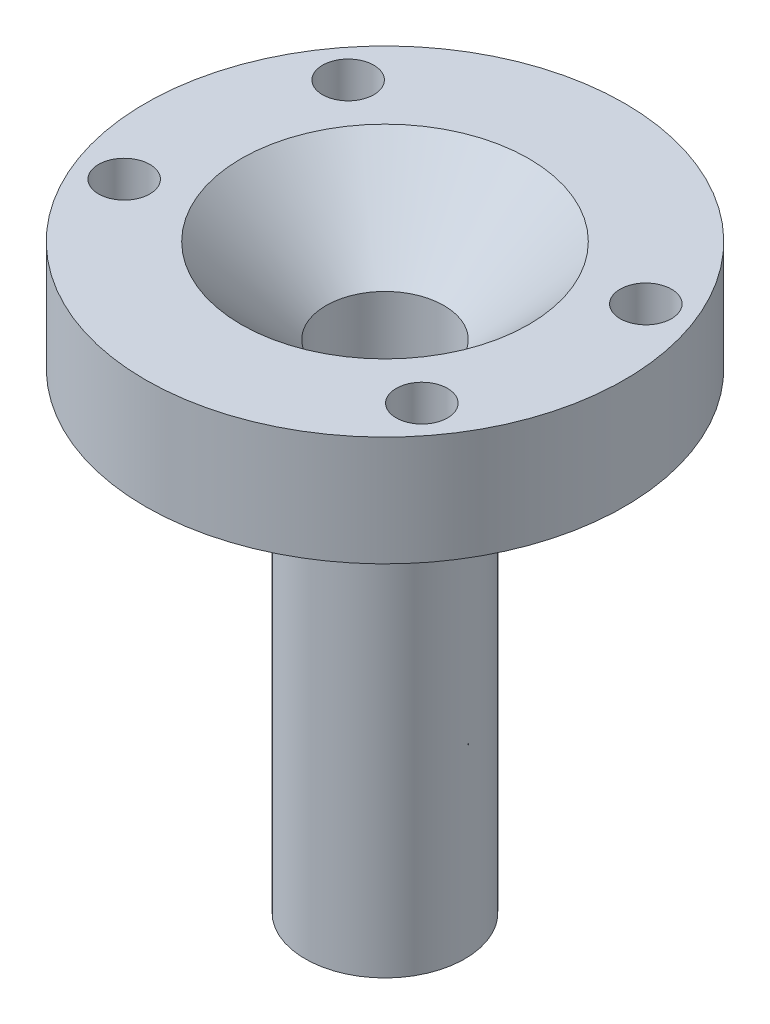
ISO-10303-21;
HEADER;
FILE_DESCRIPTION(('STEP AP214'),'2;1');
FILE_NAME('part.step','',(''),(''),'','','');
FILE_SCHEMA(('AUTOMOTIVE_DESIGN { 1 0 10303 214 1 1 1 1 }'));
ENDSEC;
DATA;
#1=APPLICATION_CONTEXT('core data for automotive mechanical design processes');
#2=APPLICATION_PROTOCOL_DEFINITION('international standard','automotive_design',2000,#1);
#3=PRODUCT_CONTEXT('',#1,'mechanical');
#4=PRODUCT('Part','Part','',(#3));
#5=PRODUCT_RELATED_PRODUCT_CATEGORY('part','',(#4));
#6=PRODUCT_DEFINITION_FORMATION('','',#4);
#7=PRODUCT_DEFINITION_CONTEXT('part definition',#1,'design');
#8=PRODUCT_DEFINITION('design','',#6,#7);
#9=PRODUCT_DEFINITION_SHAPE('','',#8);
#10=(LENGTH_UNIT() NAMED_UNIT(*) SI_UNIT(.MILLI.,.METRE.));
#11=(NAMED_UNIT(*) PLANE_ANGLE_UNIT() SI_UNIT($,.RADIAN.));
#12=(NAMED_UNIT(*) SI_UNIT($,.STERADIAN.) SOLID_ANGLE_UNIT());
#13=UNCERTAINTY_MEASURE_WITH_UNIT(LENGTH_MEASURE(1.E-05),#10,'distance_accuracy_value','');
#14=(GEOMETRIC_REPRESENTATION_CONTEXT(3) GLOBAL_UNCERTAINTY_ASSIGNED_CONTEXT((#13)) GLOBAL_UNIT_ASSIGNED_CONTEXT((#10,
#11,#12)) REPRESENTATION_CONTEXT('',''));
#15=CARTESIAN_POINT('',(0.,0.,0.));
#16=DIRECTION('',(0.,0.,1.));
#17=DIRECTION('',(1.,0.,0.));
#18=AXIS2_PLACEMENT_3D('',#15,#16,#17);
#19=CARTESIAN_POINT('',(0.,0.,-30.48));
#20=DIRECTION('',(0.,-1.,0.));
#21=DIRECTION('',(0.,0.,-1.));
#22=AXIS2_PLACEMENT_3D('',#19,#20,#21);
#23=PLANE('',#22);
#24=CARTESIAN_POINT('',(0.,0.,0.));
#25=DIRECTION('',(0.,-1.,0.));
#26=DIRECTION('',(0.,0.,-1.));
#27=AXIS2_PLACEMENT_3D('',#24,#25,#26);
#28=CIRCLE('',#27,11.76);
#29=CARTESIAN_POINT('',(0.,0.,-11.76));
#30=VERTEX_POINT('',#29);
#31=EDGE_CURVE('E12',#30,#30,#28,.F.);
#32=ORIENTED_EDGE('',*,*,#31,.T.);
#33=EDGE_LOOP('',(#32));
#34=FACE_BOUND('',#33,.T.);
#35=CARTESIAN_POINT('',(0.,0.,0.));
#36=DIRECTION('',(0.,-1.,0.));
#37=DIRECTION('',(0.,0.,-1.));
#38=AXIS2_PLACEMENT_3D('',#35,#36,#37);
#39=CIRCLE('',#38,19.05);
#40=CARTESIAN_POINT('',(0.,0.,-19.05));
#41=VERTEX_POINT('',#40);
#42=EDGE_CURVE('E150',#41,#41,#39,.T.);
#43=ORIENTED_EDGE('',*,*,#42,.T.);
#44=EDGE_LOOP('',(#43));
#45=FACE_BOUND('',#44,.T.);
#46=ADVANCED_FACE('F42',(#34,#45),#23,.T.);
#47=CARTESIAN_POINT('',(0.,30.,0.));
#48=DIRECTION('',(0.,-1.,0.));
#49=DIRECTION('',(0.,0.,-1.));
#50=AXIS2_PLACEMENT_3D('',#47,#48,#49);
#51=CYLINDRICAL_SURFACE('',#50,7.5);
#52=CARTESIAN_POINT('',(0.,3.17500000000006,0.));
#53=DIRECTION('',(0.,1.,0.));
#54=DIRECTION('',(0.,0.,1.));
#55=AXIS2_PLACEMENT_3D('',#52,#53,#54);
#56=CIRCLE('',#55,7.5);
#57=CARTESIAN_POINT('',(0.,3.17500000000006,-7.5));
#58=VERTEX_POINT('',#57);
#59=EDGE_CURVE('E55',#58,#58,#56,.T.);
#60=CARTESIAN_POINT('',(0.,-60.,0.));
#61=DIRECTION('',(0.,-1.,0.));
#62=DIRECTION('',(0.,0.,-1.));
#63=AXIS2_PLACEMENT_3D('',#60,#61,#62);
#64=CIRCLE('',#63,7.5);
#65=CARTESIAN_POINT('',(0.,-60.,-7.5));
#66=VERTEX_POINT('',#65);
#67=EDGE_CURVE('E80',#66,#66,#64,.T.);
#68=CARTESIAN_POINT('',(0.,3.17500000000006,-7.5));
#69=CARTESIAN_POINT('',(0.,2.5169270833334,-7.5));
#70=CARTESIAN_POINT('',(0.,1.85885416666673,-7.5));
#71=CARTESIAN_POINT('',(0.,0.542708333333393,-7.5));
#72=CARTESIAN_POINT('',(0.,-0.115364583333275,-7.5));
#73=CARTESIAN_POINT('',(0.,-1.43151041666661,-7.5));
#74=CARTESIAN_POINT('',(0.,-2.08958333333327,-7.5));
#75=CARTESIAN_POINT('',(0.,-3.4057291666666,-7.5));
#76=CARTESIAN_POINT('',(0.,-4.06380208333327,-7.5));
#77=CARTESIAN_POINT('',(0.,-5.37994791666661,-7.5));
#78=CARTESIAN_POINT('',(0.,-6.03802083333328,-7.5));
#79=CARTESIAN_POINT('',(0.,-7.35416666666661,-7.5));
#80=CARTESIAN_POINT('',(0.,-8.01223958333328,-7.5));
#81=CARTESIAN_POINT('',(0.,-9.32838541666661,-7.5));
#82=CARTESIAN_POINT('',(0.,-9.98645833333328,-7.5));
#83=CARTESIAN_POINT('',(0.,-11.3026041666666,-7.5));
#84=CARTESIAN_POINT('',(0.,-11.9606770833333,-7.5));
#85=CARTESIAN_POINT('',(0.,-13.2768229166666,-7.5));
#86=CARTESIAN_POINT('',(0.,-13.9348958333333,-7.5));
#87=CARTESIAN_POINT('',(0.,-15.2510416666666,-7.5));
#88=CARTESIAN_POINT('',(0.,-15.9091145833333,-7.5));
#89=CARTESIAN_POINT('',(0.,-17.2252604166666,-7.5));
#90=CARTESIAN_POINT('',(0.,-17.8833333333333,-7.5));
#91=CARTESIAN_POINT('',(0.,-19.1994791666666,-7.5));
#92=CARTESIAN_POINT('',(0.,-19.8575520833333,-7.5));
#93=CARTESIAN_POINT('',(0.,-21.1736979166666,-7.5));
#94=CARTESIAN_POINT('',(0.,-21.8317708333333,-7.5));
#95=CARTESIAN_POINT('',(0.,-23.1479166666666,-7.5));
#96=CARTESIAN_POINT('',(0.,-23.8059895833333,-7.5));
#97=CARTESIAN_POINT('',(0.,-25.1221354166666,-7.5));
#98=CARTESIAN_POINT('',(0.,-25.7802083333333,-7.5));
#99=CARTESIAN_POINT('',(0.,-27.0963541666666,-7.5));
#100=CARTESIAN_POINT('',(0.,-27.7544270833333,-7.5));
#101=CARTESIAN_POINT('',(0.,-29.0705729166666,-7.5));
#102=CARTESIAN_POINT('',(0.,-29.7286458333333,-7.5));
#103=CARTESIAN_POINT('',(0.,-31.0447916666666,-7.5));
#104=CARTESIAN_POINT('',(0.,-31.7028645833333,-7.5));
#105=CARTESIAN_POINT('',(0.,-33.0190104166666,-7.5));
#106=CARTESIAN_POINT('',(0.,-33.6770833333333,-7.5));
#107=CARTESIAN_POINT('',(0.,-34.9932291666666,-7.5));
#108=CARTESIAN_POINT('',(0.,-35.6513020833333,-7.5));
#109=CARTESIAN_POINT('',(0.,-36.9674479166666,-7.5));
#110=CARTESIAN_POINT('',(0.,-37.6255208333333,-7.5));
#111=CARTESIAN_POINT('',(0.,-38.9416666666666,-7.5));
#112=CARTESIAN_POINT('',(0.,-39.5997395833333,-7.5));
#113=CARTESIAN_POINT('',(0.,-40.9158854166666,-7.5));
#114=CARTESIAN_POINT('',(0.,-41.5739583333333,-7.5));
#115=CARTESIAN_POINT('',(0.,-42.8901041666666,-7.5));
#116=CARTESIAN_POINT('',(0.,-43.5481770833333,-7.5));
#117=CARTESIAN_POINT('',(0.,-44.8643229166666,-7.5));
#118=CARTESIAN_POINT('',(0.,-45.5223958333333,-7.5));
#119=CARTESIAN_POINT('',(0.,-46.8385416666666,-7.5));
#120=CARTESIAN_POINT('',(0.,-47.4966145833333,-7.5));
#121=CARTESIAN_POINT('',(0.,-48.8127604166666,-7.5));
#122=CARTESIAN_POINT('',(0.,-49.4708333333333,-7.5));
#123=CARTESIAN_POINT('',(0.,-50.7869791666666,-7.5));
#124=CARTESIAN_POINT('',(0.,-51.4450520833333,-7.5));
#125=CARTESIAN_POINT('',(0.,-52.7611979166667,-7.5));
#126=CARTESIAN_POINT('',(0.,-53.4192708333333,-7.5));
#127=CARTESIAN_POINT('',(0.,-54.7354166666667,-7.5));
#128=CARTESIAN_POINT('',(0.,-55.3934895833333,-7.5));
#129=CARTESIAN_POINT('',(0.,-56.7096354166667,-7.5));
#130=CARTESIAN_POINT('',(0.,-57.3677083333333,-7.5));
#131=CARTESIAN_POINT('',(0.,-58.6838541666667,-7.5));
#132=CARTESIAN_POINT('',(0.,-59.3419270833333,-7.5));
#133=CARTESIAN_POINT('',(0.,-60.,-7.5));
#134=B_SPLINE_CURVE_WITH_KNOTS('',3,(#68,#69,#70,#71,#72,#73,#74,#75,#76,#77,#78,#79,#80,#81,
#82,#83,#84,#85,#86,#87,#88,#89,#90,#91,#92,#93,#94,#95,#96,#97,#98,#99,#100,#101,#102,#103,
#104,#105,#106,#107,#108,#109,#110,#111,#112,#113,#114,#115,#116,#117,#118,#119,#120,#121,#122,
#123,#124,#125,#126,#127,#128,#129,#130,#131,#132,#133),.UNSPECIFIED.,.F.,.F.,(4,2,2,2,2,2,2,2,
2,2,2,2,2,2,2,2,2,2,2,2,2,2,2,2,2,2,2,2,2,2,2,2,4),(0.,1.97421875,3.94843750000001,5.92265625,
7.896875,9.87109375000001,11.8453125,13.81953125,15.79375,17.76796875,19.7421875,21.71640625,
23.690625,25.66484375,27.6390625,29.61328125,31.5875,33.56171875,35.5359375,37.51015625,
39.484375,41.45859375,43.4328125,45.40703125,47.38125,49.35546875,51.3296875,53.30390625,
55.2781250000001,57.2523437500001,59.2265625,61.2007812500001,63.1750000000001),.UNSPECIFIED.);
#135=EDGE_CURVE('BSEAM99',#58,#66,#134,.T.);
#136=ORIENTED_EDGE('',*,*,#59,.T.);
#137=ORIENTED_EDGE('',*,*,#67,.T.);
#138=ORIENTED_EDGE('',*,*,#135,.T.);
#139=ORIENTED_EDGE('',*,*,#135,.F.);
#140=EDGE_LOOP('',(#136,#138,#137,#139));
#141=FACE_BOUND('',#140,.T.);
#142=ADVANCED_FACE('F99',(#141),#51,.F.);
#143=CARTESIAN_POINT('',(0.,13.97,-12.7));
#144=DIRECTION('',(0.,1.,0.));
#145=DIRECTION('',(0.,0.,1.));
#146=AXIS2_PLACEMENT_3D('',#143,#144,#145);
#147=PLANE('',#146);
#148=CARTESIAN_POINT('',(0.,13.97,0.));
#149=DIRECTION('',(0.,1.,0.));
#150=DIRECTION('',(0.,0.,1.));
#151=AXIS2_PLACEMENT_3D('',#148,#149,#150);
#152=CIRCLE('',#151,18.2949999999999);
#153=CARTESIAN_POINT('',(0.,13.97,18.2949999999999));
#154=VERTEX_POINT('',#153);
#155=EDGE_CURVE('E59',#154,#154,#152,.F.);
#156=ORIENTED_EDGE('',*,*,#155,.T.);
#157=EDGE_LOOP('',(#156));
#158=FACE_BOUND('',#157,.T.);
#159=CARTESIAN_POINT('',(-20.1511748433976,13.97,-15.4625402968212));
#160=DIRECTION('',(0.,1.,0.));
#161=DIRECTION('',(0.,0.,1.));
#162=AXIS2_PLACEMENT_3D('',#159,#160,#161);
#163=CIRCLE('',#162,3.2639);
#164=CARTESIAN_POINT('',(-20.1511748433976,13.97,-12.1986402968212));
#165=VERTEX_POINT('',#164);
#166=EDGE_CURVE('E62',#165,#165,#163,.T.);
#167=ORIENTED_EDGE('',*,*,#166,.F.);
#168=EDGE_LOOP('',(#167));
#169=FACE_BOUND('',#168,.T.);
#170=CARTESIAN_POINT('',(23.4665401257865,13.97,-9.72015918207379));
#171=DIRECTION('',(0.,1.,0.));
#172=DIRECTION('',(0.,0.,1.));
#173=AXIS2_PLACEMENT_3D('',#170,#171,#172);
#174=CIRCLE('',#173,3.2639);
#175=CARTESIAN_POINT('',(23.4665401257865,13.97,-6.45625918207379));
#176=VERTEX_POINT('',#175);
#177=EDGE_CURVE('E67',#176,#176,#174,.T.);
#178=ORIENTED_EDGE('',*,*,#177,.F.);
#179=EDGE_LOOP('',(#178));
#180=FACE_BOUND('',#179,.T.);
#181=CARTESIAN_POINT('',(20.1511748433977,13.97,15.4625402968211));
#182=DIRECTION('',(0.,1.,0.));
#183=DIRECTION('',(0.,0.,1.));
#184=AXIS2_PLACEMENT_3D('',#181,#182,#183);
#185=CIRCLE('',#184,3.2639);
#186=CARTESIAN_POINT('',(20.1511748433977,13.97,18.7264402968211));
#187=VERTEX_POINT('',#186);
#188=EDGE_CURVE('E71',#187,#187,#185,.T.);
#189=ORIENTED_EDGE('',*,*,#188,.F.);
#190=EDGE_LOOP('',(#189));
#191=FACE_BOUND('',#190,.T.);
#192=CARTESIAN_POINT('',(-23.4665401257864,13.97,9.72015918207384));
#193=DIRECTION('',(0.,1.,0.));
#194=DIRECTION('',(0.,0.,1.));
#195=AXIS2_PLACEMENT_3D('',#192,#193,#194);
#196=CIRCLE('',#195,3.2639);
#197=CARTESIAN_POINT('',(-23.4665401257864,13.97,12.9840591820738));
#198=VERTEX_POINT('',#197);
#199=EDGE_CURVE('E74',#198,#198,#196,.T.);
#200=ORIENTED_EDGE('',*,*,#199,.F.);
#201=EDGE_LOOP('',(#200));
#202=FACE_BOUND('',#201,.T.);
#203=CARTESIAN_POINT('',(0.,13.97,0.));
#204=DIRECTION('',(0.,1.,0.));
#205=DIRECTION('',(0.,0.,1.));
#206=AXIS2_PLACEMENT_3D('',#203,#204,#205);
#207=CIRCLE('',#206,30.48);
#208=CARTESIAN_POINT('',(0.,13.97,30.48));
#209=VERTEX_POINT('',#208);
#210=EDGE_CURVE('E46',#209,#209,#207,.F.);
#211=ORIENTED_EDGE('',*,*,#210,.F.);
#212=EDGE_LOOP('',(#211));
#213=FACE_BOUND('',#212,.T.);
#214=ADVANCED_FACE('F44',(#158,#169,#180,#191,#202,#213),#147,.T.);
#215=CARTESIAN_POINT('',(0.,0.,0.));
#216=DIRECTION('',(0.,-1.,0.));
#217=DIRECTION('',(0.,0.,-1.));
#218=AXIS2_PLACEMENT_3D('',#215,#216,#217);
#219=CYLINDRICAL_SURFACE('',#218,30.48);
#220=ORIENTED_EDGE('',*,*,#210,.T.);
#221=EDGE_LOOP('',(#220));
#222=FACE_BOUND('',#221,.T.);
#223=CARTESIAN_POINT('',(0.,0.,0.));
#224=DIRECTION('',(0.,-1.,0.));
#225=DIRECTION('',(0.,0.,-1.));
#226=AXIS2_PLACEMENT_3D('',#223,#224,#225);
#227=CIRCLE('',#226,30.48);
#228=CARTESIAN_POINT('',(0.,0.,-30.48));
#229=VERTEX_POINT('',#228);
#230=EDGE_CURVE('E94',#229,#229,#227,.T.);
#231=ORIENTED_EDGE('',*,*,#230,.F.);
#232=EDGE_LOOP('',(#231));
#233=FACE_BOUND('',#232,.T.);
#234=ADVANCED_FACE('F112',(#222,#233),#219,.T.);
#235=CARTESIAN_POINT('',(0.,0.,0.));
#236=DIRECTION('',(0.,-1.,0.));
#237=DIRECTION('',(0.,0.,-1.));
#238=AXIS2_PLACEMENT_3D('',#235,#236,#237);
#239=CIRCLE('',#238,21.082);
#240=CARTESIAN_POINT('',(0.,0.,-21.082));
#241=VERTEX_POINT('',#240);
#242=EDGE_CURVE('E155',#241,#241,#239,.T.);
#243=ORIENTED_EDGE('',*,*,#242,.F.);
#244=EDGE_LOOP('',(#243));
#245=FACE_BOUND('',#244,.T.);
#246=CARTESIAN_POINT('',(-20.1511748433976,0.,-15.4625402968212));
#247=DIRECTION('',(0.,-1.,0.));
#248=DIRECTION('',(0.,0.,-1.));
#249=AXIS2_PLACEMENT_3D('',#246,#247,#248);
#250=CIRCLE('',#249,3.2639);
#251=CARTESIAN_POINT('',(-20.1511748433976,0.,-18.7264402968212));
#252=VERTEX_POINT('',#251);
#253=EDGE_CURVE('E65',#252,#252,#250,.T.);
#254=ORIENTED_EDGE('',*,*,#253,.F.);
#255=EDGE_LOOP('',(#254));
#256=FACE_BOUND('',#255,.T.);
#257=CARTESIAN_POINT('',(23.4665401257865,0.,-9.72015918207379));
#258=DIRECTION('',(0.,-1.,0.));
#259=DIRECTION('',(0.,0.,-1.));
#260=AXIS2_PLACEMENT_3D('',#257,#258,#259);
#261=CIRCLE('',#260,3.2639);
#262=CARTESIAN_POINT('',(23.4665401257865,0.,-12.9840591820738));
#263=VERTEX_POINT('',#262);
#264=EDGE_CURVE('E70',#263,#263,#261,.T.);
#265=ORIENTED_EDGE('',*,*,#264,.F.);
#266=EDGE_LOOP('',(#265));
#267=FACE_BOUND('',#266,.T.);
#268=CARTESIAN_POINT('',(20.1511748433977,0.,15.4625402968211));
#269=DIRECTION('',(0.,-1.,0.));
#270=DIRECTION('',(0.,0.,-1.));
#271=AXIS2_PLACEMENT_3D('',#268,#269,#270);
#272=CIRCLE('',#271,3.2639);
#273=CARTESIAN_POINT('',(20.1511748433977,0.,12.1986402968211));
#274=VERTEX_POINT('',#273);
#275=EDGE_CURVE('E73',#274,#274,#272,.T.);
#276=ORIENTED_EDGE('',*,*,#275,.F.);
#277=EDGE_LOOP('',(#276));
#278=FACE_BOUND('',#277,.T.);
#279=CARTESIAN_POINT('',(-23.4665401257864,0.,9.72015918207384));
#280=DIRECTION('',(0.,-1.,0.));
#281=DIRECTION('',(0.,0.,-1.));
#282=AXIS2_PLACEMENT_3D('',#279,#280,#281);
#283=CIRCLE('',#282,3.2639);
#284=CARTESIAN_POINT('',(-23.4665401257864,0.,6.45625918207384));
#285=VERTEX_POINT('',#284);
#286=EDGE_CURVE('E76',#285,#285,#283,.T.);
#287=ORIENTED_EDGE('',*,*,#286,.F.);
#288=EDGE_LOOP('',(#287));
#289=FACE_BOUND('',#288,.T.);
#290=ORIENTED_EDGE('',*,*,#230,.T.);
#291=EDGE_LOOP('',(#290));
#292=FACE_BOUND('',#291,.T.);
#293=ADVANCED_FACE('F125',(#245,#256,#267,#278,#289,#292),#23,.T.);
#294=CARTESIAN_POINT('',(0.,0.,0.));
#295=DIRECTION('',(0.,-1.,0.));
#296=DIRECTION('',(0.,0.,-1.));
#297=AXIS2_PLACEMENT_3D('',#294,#295,#296);
#298=CYLINDRICAL_SURFACE('',#297,10.16);
#299=CARTESIAN_POINT('',(0.,-1.60000000000002,0.));
#300=DIRECTION('',(0.,-1.,0.));
#301=DIRECTION('',(0.,0.,-1.));
#302=AXIS2_PLACEMENT_3D('',#299,#300,#301);
#303=CIRCLE('',#302,10.16);
#304=CARTESIAN_POINT('',(0.,-1.60000000000002,-10.16));
#305=VERTEX_POINT('',#304);
#306=EDGE_CURVE('E50',#305,#305,#303,.T.);
#307=ORIENTED_EDGE('',*,*,#306,.T.);
#308=EDGE_LOOP('',(#307));
#309=FACE_BOUND('',#308,.T.);
#310=CARTESIAN_POINT('',(0.,-60.,0.));
#311=DIRECTION('',(0.,-1.,0.));
#312=DIRECTION('',(0.,0.,-1.));
#313=AXIS2_PLACEMENT_3D('',#310,#311,#312);
#314=CIRCLE('',#313,10.16);
#315=CARTESIAN_POINT('',(0.,-60.,-10.16));
#316=VERTEX_POINT('',#315);
#317=EDGE_CURVE('E91',#316,#316,#314,.T.);
#318=ORIENTED_EDGE('',*,*,#317,.F.);
#319=EDGE_LOOP('',(#318));
#320=FACE_BOUND('',#319,.T.);
#321=ADVANCED_FACE('F130',(#309,#320),#298,.T.);
#322=CARTESIAN_POINT('',(0.,-60.,-10.16));
#323=DIRECTION('',(0.,-1.,0.));
#324=DIRECTION('',(0.,0.,-1.));
#325=AXIS2_PLACEMENT_3D('',#322,#323,#324);
#326=PLANE('',#325);
#327=ORIENTED_EDGE('',*,*,#67,.F.);
#328=EDGE_LOOP('',(#327));
#329=FACE_BOUND('',#328,.T.);
#330=ORIENTED_EDGE('',*,*,#317,.T.);
#331=EDGE_LOOP('',(#330));
#332=FACE_BOUND('',#331,.T.);
#333=ADVANCED_FACE('F136',(#329,#332),#326,.T.);
#334=CARTESIAN_POINT('',(-23.4665401257864,6.35,9.72015918207384));
#335=DIRECTION('',(0.,1.,0.));
#336=DIRECTION('',(0.,0.,1.));
#337=AXIS2_PLACEMENT_3D('',#334,#335,#336);
#338=CYLINDRICAL_SURFACE('',#337,3.2639);
#339=ORIENTED_EDGE('',*,*,#286,.T.);
#340=EDGE_LOOP('',(#339));
#341=FACE_BOUND('',#340,.T.);
#342=ORIENTED_EDGE('',*,*,#199,.T.);
#343=EDGE_LOOP('',(#342));
#344=FACE_BOUND('',#343,.T.);
#345=ADVANCED_FACE('F172',(#341,#344),#338,.F.);
#346=CARTESIAN_POINT('',(20.1511748433977,6.35,15.4625402968211));
#347=DIRECTION('',(0.,1.,0.));
#348=DIRECTION('',(0.,0.,1.));
#349=AXIS2_PLACEMENT_3D('',#346,#347,#348);
#350=CYLINDRICAL_SURFACE('',#349,3.2639);
#351=ORIENTED_EDGE('',*,*,#275,.T.);
#352=EDGE_LOOP('',(#351));
#353=FACE_BOUND('',#352,.T.);
#354=ORIENTED_EDGE('',*,*,#188,.T.);
#355=EDGE_LOOP('',(#354));
#356=FACE_BOUND('',#355,.T.);
#357=ADVANCED_FACE('F174',(#353,#356),#350,.F.);
#358=CARTESIAN_POINT('',(23.4665401257865,6.35,-9.72015918207379));
#359=DIRECTION('',(0.,1.,0.));
#360=DIRECTION('',(0.,0.,1.));
#361=AXIS2_PLACEMENT_3D('',#358,#359,#360);
#362=CYLINDRICAL_SURFACE('',#361,3.2639);
#363=ORIENTED_EDGE('',*,*,#264,.T.);
#364=EDGE_LOOP('',(#363));
#365=FACE_BOUND('',#364,.T.);
#366=ORIENTED_EDGE('',*,*,#177,.T.);
#367=EDGE_LOOP('',(#366));
#368=FACE_BOUND('',#367,.T.);
#369=ADVANCED_FACE('F180',(#365,#368),#362,.F.);
#370=CARTESIAN_POINT('',(-20.1511748433976,6.35,-15.4625402968212));
#371=DIRECTION('',(0.,1.,0.));
#372=DIRECTION('',(0.,0.,1.));
#373=AXIS2_PLACEMENT_3D('',#370,#371,#372);
#374=CYLINDRICAL_SURFACE('',#373,3.2639);
#375=ORIENTED_EDGE('',*,*,#253,.T.);
#376=EDGE_LOOP('',(#375));
#377=FACE_BOUND('',#376,.T.);
#378=ORIENTED_EDGE('',*,*,#166,.T.);
#379=EDGE_LOOP('',(#378));
#380=FACE_BOUND('',#379,.T.);
#381=ADVANCED_FACE('F106',(#377,#380),#374,.F.);
#382=CARTESIAN_POINT('',(0.,6.35,0.));
#383=DIRECTION('',(0.,1.,0.));
#384=DIRECTION('',(0.,0.,1.));
#385=AXIS2_PLACEMENT_3D('',#382,#383,#384);
#386=CONICAL_SURFACE('',#385,10.6749999999999,0.785398163397448);
#387=ORIENTED_EDGE('',*,*,#59,.F.);
#388=EDGE_LOOP('',(#387));
#389=FACE_BOUND('',#388,.T.);
#390=ORIENTED_EDGE('',*,*,#155,.F.);
#391=EDGE_LOOP('',(#390));
#392=FACE_BOUND('',#391,.T.);
#393=ADVANCED_FACE('F102',(#389,#392),#386,.F.);
#394=CARTESIAN_POINT('',(0.,-1.60000000000002,0.));
#395=DIRECTION('',(0.,1.,0.));
#396=DIRECTION('',(0.,0.,1.));
#397=AXIS2_PLACEMENT_3D('',#394,#395,#396);
#398=CONICAL_SURFACE('',#397,10.16,0.785398163397442);
#399=ORIENTED_EDGE('',*,*,#31,.F.);
#400=EDGE_LOOP('',(#399));
#401=FACE_BOUND('',#400,.T.);
#402=ORIENTED_EDGE('',*,*,#306,.F.);
#403=EDGE_LOOP('',(#402));
#404=FACE_BOUND('',#403,.T.);
#405=ADVANCED_FACE('F105',(#401,#404),#398,.T.);
#406=CARTESIAN_POINT('',(0.,1.27,0.));
#407=DIRECTION('',(0.,-1.,0.));
#408=DIRECTION('',(0.,0.,-1.));
#409=AXIS2_PLACEMENT_3D('',#406,#407,#408);
#410=CYLINDRICAL_SURFACE('',#409,21.082);
#411=CARTESIAN_POINT('',(0.,1.27,0.));
#412=DIRECTION('',(0.,-1.,0.));
#413=DIRECTION('',(0.,0.,-1.));
#414=AXIS2_PLACEMENT_3D('',#411,#412,#413);
#415=CIRCLE('',#414,21.082);
#416=CARTESIAN_POINT('',(0.,1.27,-21.082));
#417=VERTEX_POINT('',#416);
#418=EDGE_CURVE('E66',#417,#417,#415,.T.);
#419=ORIENTED_EDGE('',*,*,#418,.F.);
#420=EDGE_LOOP('',(#419));
#421=FACE_BOUND('',#420,.T.);
#422=ORIENTED_EDGE('',*,*,#242,.T.);
#423=EDGE_LOOP('',(#422));
#424=FACE_BOUND('',#423,.T.);
#425=ADVANCED_FACE('F189',(#421,#424),#410,.F.);
#426=CARTESIAN_POINT('',(0.,1.27,0.));
#427=DIRECTION('',(0.,-1.,0.));
#428=DIRECTION('',(0.,0.,-1.));
#429=AXIS2_PLACEMENT_3D('',#426,#427,#428);
#430=PLANE('',#429);
#431=CARTESIAN_POINT('',(0.,1.27,0.));
#432=DIRECTION('',(0.,-1.,0.));
#433=DIRECTION('',(0.,0.,-1.));
#434=AXIS2_PLACEMENT_3D('',#431,#432,#433);
#435=CIRCLE('',#434,19.05);
#436=CARTESIAN_POINT('',(0.,1.27,-19.05));
#437=VERTEX_POINT('',#436);
#438=EDGE_CURVE('E152',#437,#437,#435,.T.);
#439=ORIENTED_EDGE('',*,*,#438,.F.);
#440=EDGE_LOOP('',(#439));
#441=FACE_BOUND('',#440,.T.);
#442=ORIENTED_EDGE('',*,*,#418,.T.);
#443=EDGE_LOOP('',(#442));
#444=FACE_BOUND('',#443,.T.);
#445=ADVANCED_FACE('F192',(#441,#444),#430,.T.);
#446=CARTESIAN_POINT('',(0.,1.27,0.));
#447=DIRECTION('',(0.,-1.,0.));
#448=DIRECTION('',(0.,0.,-1.));
#449=AXIS2_PLACEMENT_3D('',#446,#447,#448);
#450=CYLINDRICAL_SURFACE('',#449,19.05);
#451=ORIENTED_EDGE('',*,*,#438,.T.);
#452=EDGE_LOOP('',(#451));
#453=FACE_BOUND('',#452,.T.);
#454=ORIENTED_EDGE('',*,*,#42,.F.);
#455=EDGE_LOOP('',(#454));
#456=FACE_BOUND('',#455,.T.);
#457=ADVANCED_FACE('F196',(#453,#456),#450,.T.);
#458=CLOSED_SHELL('',(#46,#142,#214,#234,#293,#321,#333,#345,#357,#369,#381,#393,#405,#425,#445,#457));
#459=MANIFOLD_SOLID_BREP('B2',#458);
#460=ADVANCED_BREP_SHAPE_REPRESENTATION('',(#18,#459),#14);
#461=SHAPE_DEFINITION_REPRESENTATION(#9,#460);
ENDSEC;
END-ISO-10303-21;
